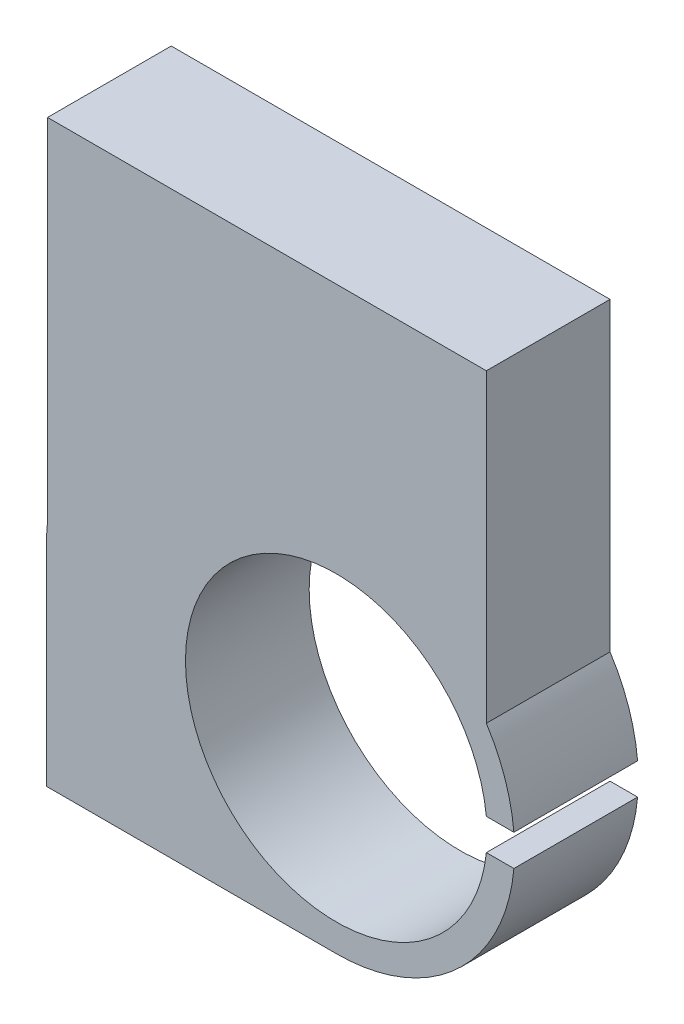
ISO-10303-21;
HEADER;
FILE_DESCRIPTION(('STEP AP214'),'2;1');
FILE_NAME('part.step','',(''),(''),'','','');
FILE_SCHEMA(('AUTOMOTIVE_DESIGN { 1 0 10303 214 1 1 1 1 }'));
ENDSEC;
DATA;
#1=APPLICATION_CONTEXT('core data for automotive mechanical design processes');
#2=APPLICATION_PROTOCOL_DEFINITION('international standard','automotive_design',2000,#1);
#3=PRODUCT_CONTEXT('',#1,'mechanical');
#4=PRODUCT('Part','Part','',(#3));
#5=PRODUCT_RELATED_PRODUCT_CATEGORY('part','',(#4));
#6=PRODUCT_DEFINITION_FORMATION('','',#4);
#7=PRODUCT_DEFINITION_CONTEXT('part definition',#1,'design');
#8=PRODUCT_DEFINITION('design','',#6,#7);
#9=PRODUCT_DEFINITION_SHAPE('','',#8);
#10=(LENGTH_UNIT() NAMED_UNIT(*) SI_UNIT(.MILLI.,.METRE.));
#11=(NAMED_UNIT(*) PLANE_ANGLE_UNIT() SI_UNIT($,.RADIAN.));
#12=(NAMED_UNIT(*) SI_UNIT($,.STERADIAN.) SOLID_ANGLE_UNIT());
#13=UNCERTAINTY_MEASURE_WITH_UNIT(LENGTH_MEASURE(1.E-05),#10,'distance_accuracy_value','');
#14=(GEOMETRIC_REPRESENTATION_CONTEXT(3) GLOBAL_UNCERTAINTY_ASSIGNED_CONTEXT((#13)) GLOBAL_UNIT_ASSIGNED_CONTEXT((#10,
#11,#12)) REPRESENTATION_CONTEXT('',''));
#15=CARTESIAN_POINT('',(0.,0.,0.));
#16=DIRECTION('',(0.,0.,1.));
#17=DIRECTION('',(1.,0.,0.));
#18=AXIS2_PLACEMENT_3D('',#15,#16,#17);
#19=CARTESIAN_POINT('',(-29.0092477147416,-3.56026036950048,28.));
#20=DIRECTION('',(0.,1.,0.));
#21=DIRECTION('',(0.,0.,1.));
#22=AXIS2_PLACEMENT_3D('',#19,#20,#21);
#23=PLANE('',#22);
#24=DIRECTION('',(0.,0.,-1.));
#25=VECTOR('',#24,1.);
#26=CARTESIAN_POINT('',(114.990752285258,-3.56026036950048,28.));
#27=LINE('',#26,#25);
#28=CARTESIAN_POINT('',(114.990752285258,-3.56026036950048,7.89310098485885));
#29=VERTEX_POINT('',#28);
#30=CARTESIAN_POINT('',(114.990752285258,-3.56026036950048,0.));
#31=VERTEX_POINT('',#30);
#32=EDGE_CURVE('E126',#29,#31,#27,.T.);
#33=ORIENTED_EDGE('',*,*,#32,.F.);
#34=DIRECTION('',(-1.,0.,0.));
#35=VECTOR('',#34,1.);
#36=CARTESIAN_POINT('',(-29.0092477147416,-3.56026036950048,7.89310098485885));
#37=LINE('',#36,#35);
#38=CARTESIAN_POINT('',(96.4918651622711,-3.56026036950047,7.89310098485885));
#39=VERTEX_POINT('',#38);
#40=EDGE_CURVE('E116',#29,#39,#37,.T.);
#41=ORIENTED_EDGE('',*,*,#40,.T.);
#42=DIRECTION('',(0.,0.,-1.));
#43=VECTOR('',#42,1.);
#44=CARTESIAN_POINT('',(96.4918651622711,-3.56026036950048,28.));
#45=LINE('',#44,#43);
#46=CARTESIAN_POINT('',(96.4918651622711,-3.56026036950048,0.));
#47=VERTEX_POINT('',#46);
#48=EDGE_CURVE('E124',#39,#47,#45,.T.);
#49=ORIENTED_EDGE('',*,*,#48,.T.);
#50=DIRECTION('',(1.,0.,0.));
#51=VECTOR('',#50,1.);
#52=CARTESIAN_POINT('',(-29.0092477147416,-3.56026036950048,0.));
#53=LINE('',#52,#51);
#54=EDGE_CURVE('E132',#47,#31,#53,.T.);
#55=ORIENTED_EDGE('',*,*,#54,.T.);
#56=EDGE_LOOP('',(#33,#41,#49,#55));
#57=FACE_BOUND('',#56,.T.);
#58=ADVANCED_FACE('F33',(#57),#23,.F.);
#59=CARTESIAN_POINT('',(114.990752285258,7.81473963049952,28.));
#60=DIRECTION('',(0.,0.,-1.));
#61=DIRECTION('',(-1.,0.,0.));
#62=AXIS2_PLACEMENT_3D('',#59,#60,#61);
#63=CYLINDRICAL_SURFACE('',#62,11.375);
#64=DIRECTION('',(0.,0.,-1.));
#65=VECTOR('',#64,1.);
#66=CARTESIAN_POINT('',(126.321710982562,6.81473963049952,28.));
#67=LINE('',#66,#65);
#68=CARTESIAN_POINT('',(126.321710982562,6.81473963049952,7.89310098485885));
#69=VERTEX_POINT('',#68);
#70=CARTESIAN_POINT('',(126.321710982562,6.81473963049952,0.));
#71=VERTEX_POINT('',#70);
#72=EDGE_CURVE('E172',#69,#71,#67,.T.);
#73=ORIENTED_EDGE('',*,*,#72,.F.);
#74=CARTESIAN_POINT('',(114.990752285258,7.81473963049952,7.89310098485885));
#75=DIRECTION('',(0.,0.,-1.));
#76=DIRECTION('',(0.,1.,0.));
#77=AXIS2_PLACEMENT_3D('',#74,#75,#76);
#78=CIRCLE('',#77,11.375);
#79=EDGE_CURVE('E128',#69,#29,#78,.T.);
#80=ORIENTED_EDGE('',*,*,#79,.T.);
#81=ORIENTED_EDGE('',*,*,#32,.T.);
#82=CARTESIAN_POINT('',(114.990752285258,7.81473963049952,0.));
#83=DIRECTION('',(0.,0.,1.));
#84=DIRECTION('',(1.,0.,0.));
#85=AXIS2_PLACEMENT_3D('',#82,#83,#84);
#86=CIRCLE('',#85,11.375);
#87=EDGE_CURVE('E134',#31,#71,#86,.T.);
#88=ORIENTED_EDGE('',*,*,#87,.T.);
#89=EDGE_LOOP('',(#73,#80,#81,#88));
#90=FACE_BOUND('',#89,.T.);
#91=ADVANCED_FACE('F186',(#90),#63,.T.);
#92=CARTESIAN_POINT('',(126.321710982562,6.81473963049952,28.));
#93=DIRECTION('',(0.,-1.,0.));
#94=DIRECTION('',(0.,0.,-1.));
#95=AXIS2_PLACEMENT_3D('',#92,#93,#94);
#96=PLANE('',#95);
#97=DIRECTION('',(0.,0.,-1.));
#98=VECTOR('',#97,1.);
#99=CARTESIAN_POINT('',(124.563663284531,6.81473963049952,28.));
#100=LINE('',#99,#98);
#101=CARTESIAN_POINT('',(124.563663284531,6.81473963049952,7.89310098485885));
#102=VERTEX_POINT('',#101);
#103=CARTESIAN_POINT('',(124.563663284531,6.81473963049952,0.));
#104=VERTEX_POINT('',#103);
#105=EDGE_CURVE('E170',#102,#104,#100,.T.);
#106=ORIENTED_EDGE('',*,*,#105,.F.);
#107=DIRECTION('',(1.,0.,0.));
#108=VECTOR('',#107,1.);
#109=CARTESIAN_POINT('',(126.321710982562,6.81473963049952,7.89310098485885));
#110=LINE('',#109,#108);
#111=EDGE_CURVE('E188',#102,#69,#110,.T.);
#112=ORIENTED_EDGE('',*,*,#111,.T.);
#113=ORIENTED_EDGE('',*,*,#72,.T.);
#114=DIRECTION('',(-1.,0.,0.));
#115=VECTOR('',#114,1.);
#116=CARTESIAN_POINT('',(126.321710982562,6.81473963049952,0.));
#117=LINE('',#116,#115);
#118=EDGE_CURVE('E140',#71,#104,#117,.T.);
#119=ORIENTED_EDGE('',*,*,#118,.T.);
#120=EDGE_LOOP('',(#106,#112,#113,#119));
#121=FACE_BOUND('',#120,.T.);
#122=ADVANCED_FACE('F233',(#121),#96,.F.);
#123=CARTESIAN_POINT('',(114.990752285258,7.81473963049952,28.));
#124=DIRECTION('',(0.,0.,-1.));
#125=DIRECTION('',(-1.,0.,0.));
#126=AXIS2_PLACEMENT_3D('',#123,#124,#125);
#127=CYLINDRICAL_SURFACE('',#126,9.62499999999999);
#128=DIRECTION('',(0.,0.,-1.));
#129=VECTOR('',#128,1.);
#130=CARTESIAN_POINT('',(124.563663284531,8.81473963049952,28.));
#131=LINE('',#130,#129);
#132=CARTESIAN_POINT('',(124.563663284531,8.81473963049952,7.89310098485885));
#133=VERTEX_POINT('',#132);
#134=CARTESIAN_POINT('',(124.563663284531,8.81473963049952,0.));
#135=VERTEX_POINT('',#134);
#136=EDGE_CURVE('E168',#133,#135,#131,.T.);
#137=ORIENTED_EDGE('',*,*,#136,.F.);
#138=CARTESIAN_POINT('',(114.990752285258,7.81473963049952,7.89310098485885));
#139=DIRECTION('',(0.,0.,-1.));
#140=DIRECTION('',(0.,1.,0.));
#141=AXIS2_PLACEMENT_3D('',#138,#139,#140);
#142=CIRCLE('',#141,9.62499999999999);
#143=EDGE_CURVE('E190',#133,#102,#142,.F.);
#144=ORIENTED_EDGE('',*,*,#143,.T.);
#145=ORIENTED_EDGE('',*,*,#105,.T.);
#146=CARTESIAN_POINT('',(114.990752285258,7.81473963049952,0.));
#147=DIRECTION('',(0.,0.,-1.));
#148=DIRECTION('',(1.,0.,0.));
#149=AXIS2_PLACEMENT_3D('',#146,#147,#148);
#150=CIRCLE('',#149,9.62499999999999);
#151=EDGE_CURVE('E143',#104,#135,#150,.T.);
#152=ORIENTED_EDGE('',*,*,#151,.T.);
#153=EDGE_LOOP('',(#137,#144,#145,#152));
#154=FACE_BOUND('',#153,.T.);
#155=ADVANCED_FACE('F230',(#154),#127,.F.);
#156=CARTESIAN_POINT('',(126.321710982562,8.81473963049952,28.));
#157=DIRECTION('',(0.,1.,0.));
#158=DIRECTION('',(0.,0.,1.));
#159=AXIS2_PLACEMENT_3D('',#156,#157,#158);
#160=PLANE('',#159);
#161=DIRECTION('',(0.,0.,-1.));
#162=VECTOR('',#161,1.);
#163=CARTESIAN_POINT('',(126.321710982562,8.81473963049952,28.));
#164=LINE('',#163,#162);
#165=CARTESIAN_POINT('',(126.321710982562,8.81473963049952,7.89310098485885));
#166=VERTEX_POINT('',#165);
#167=CARTESIAN_POINT('',(126.321710982562,8.81473963049952,0.));
#168=VERTEX_POINT('',#167);
#169=EDGE_CURVE('E166',#166,#168,#164,.T.);
#170=ORIENTED_EDGE('',*,*,#169,.F.);
#171=DIRECTION('',(-1.,0.,0.));
#172=VECTOR('',#171,1.);
#173=CARTESIAN_POINT('',(126.321710982562,8.81473963049952,7.89310098485885));
#174=LINE('',#173,#172);
#175=EDGE_CURVE('E195',#166,#133,#174,.T.);
#176=ORIENTED_EDGE('',*,*,#175,.T.);
#177=ORIENTED_EDGE('',*,*,#136,.T.);
#178=DIRECTION('',(1.,0.,0.));
#179=VECTOR('',#178,1.);
#180=CARTESIAN_POINT('',(126.321710982562,8.81473963049952,0.));
#181=LINE('',#180,#179);
#182=EDGE_CURVE('E146',#135,#168,#181,.T.);
#183=ORIENTED_EDGE('',*,*,#182,.T.);
#184=EDGE_LOOP('',(#170,#176,#177,#183));
#185=FACE_BOUND('',#184,.T.);
#186=ADVANCED_FACE('F227',(#185),#160,.F.);
#187=CARTESIAN_POINT('',(114.990752285258,7.81473963049952,28.));
#188=DIRECTION('',(0.,0.,-1.));
#189=DIRECTION('',(-1.,0.,0.));
#190=AXIS2_PLACEMENT_3D('',#187,#188,#189);
#191=CYLINDRICAL_SURFACE('',#190,11.375);
#192=DIRECTION('',(0.,0.,-1.));
#193=VECTOR('',#192,1.);
#194=CARTESIAN_POINT('',(124.563663284531,13.9588424942218,28.));
#195=LINE('',#194,#193);
#196=CARTESIAN_POINT('',(124.563663284531,13.9588424942218,7.89310098485885));
#197=VERTEX_POINT('',#196);
#198=CARTESIAN_POINT('',(124.563663284531,13.9588424942218,0.));
#199=VERTEX_POINT('',#198);
#200=EDGE_CURVE('E164',#197,#199,#195,.T.);
#201=ORIENTED_EDGE('',*,*,#200,.F.);
#202=CARTESIAN_POINT('',(114.990752285258,7.81473963049952,7.89310098485885));
#203=DIRECTION('',(0.,0.,-1.));
#204=DIRECTION('',(0.,1.,0.));
#205=AXIS2_PLACEMENT_3D('',#202,#203,#204);
#206=CIRCLE('',#205,11.375);
#207=EDGE_CURVE('E198',#197,#166,#206,.T.);
#208=ORIENTED_EDGE('',*,*,#207,.T.);
#209=ORIENTED_EDGE('',*,*,#169,.T.);
#210=CARTESIAN_POINT('',(114.990752285258,7.81473963049952,0.));
#211=DIRECTION('',(0.,0.,1.));
#212=DIRECTION('',(1.,0.,0.));
#213=AXIS2_PLACEMENT_3D('',#210,#211,#212);
#214=CIRCLE('',#213,11.375);
#215=EDGE_CURVE('E149',#168,#199,#214,.T.);
#216=ORIENTED_EDGE('',*,*,#215,.T.);
#217=EDGE_LOOP('',(#201,#208,#209,#216));
#218=FACE_BOUND('',#217,.T.);
#219=ADVANCED_FACE('F224',(#218),#191,.T.);
#220=CARTESIAN_POINT('',(124.563663284531,13.9588424942218,28.));
#221=DIRECTION('',(-1.,0.,0.));
#222=DIRECTION('',(0.,0.,1.));
#223=AXIS2_PLACEMENT_3D('',#220,#221,#222);
#224=PLANE('',#223);
#225=DIRECTION('',(0.,0.,-1.));
#226=VECTOR('',#225,1.);
#227=CARTESIAN_POINT('',(124.563663284531,33.4397396304995,28.));
#228=LINE('',#227,#226);
#229=CARTESIAN_POINT('',(124.563663284531,33.4397396304995,7.89310098485885));
#230=VERTEX_POINT('',#229);
#231=CARTESIAN_POINT('',(124.563663284531,33.4397396304995,0.));
#232=VERTEX_POINT('',#231);
#233=EDGE_CURVE('E162',#230,#232,#228,.T.);
#234=ORIENTED_EDGE('',*,*,#233,.F.);
#235=DIRECTION('',(0.,-1.,0.));
#236=VECTOR('',#235,1.);
#237=CARTESIAN_POINT('',(124.563663284531,13.9588424942218,7.89310098485885));
#238=LINE('',#237,#236);
#239=EDGE_CURVE('E201',#230,#197,#238,.T.);
#240=ORIENTED_EDGE('',*,*,#239,.T.);
#241=ORIENTED_EDGE('',*,*,#200,.T.);
#242=DIRECTION('',(0.,1.,0.));
#243=VECTOR('',#242,1.);
#244=CARTESIAN_POINT('',(124.563663284531,13.9588424942218,0.));
#245=LINE('',#244,#243);
#246=EDGE_CURVE('E152',#199,#232,#245,.T.);
#247=ORIENTED_EDGE('',*,*,#246,.T.);
#248=EDGE_LOOP('',(#234,#240,#241,#247));
#249=FACE_BOUND('',#248,.T.);
#250=ADVANCED_FACE('F221',(#249),#224,.F.);
#251=CARTESIAN_POINT('',(124.563663284531,33.4397396304995,28.));
#252=DIRECTION('',(0.,-1.,0.));
#253=DIRECTION('',(0.,0.,-1.));
#254=AXIS2_PLACEMENT_3D('',#251,#252,#253);
#255=PLANE('',#254);
#256=DIRECTION('',(0.,0.,-1.));
#257=VECTOR('',#256,1.);
#258=CARTESIAN_POINT('',(96.5636632845313,33.4397396304995,28.));
#259=LINE('',#258,#257);
#260=CARTESIAN_POINT('',(96.5636632845313,33.4397396304995,7.89310098485885));
#261=VERTEX_POINT('',#260);
#262=CARTESIAN_POINT('',(96.5636632845313,33.4397396304995,0.));
#263=VERTEX_POINT('',#262);
#264=EDGE_CURVE('E160',#261,#263,#259,.T.);
#265=ORIENTED_EDGE('',*,*,#264,.F.);
#266=DIRECTION('',(1.,0.,0.));
#267=VECTOR('',#266,1.);
#268=CARTESIAN_POINT('',(124.563663284531,33.4397396304995,7.89310098485885));
#269=LINE('',#268,#267);
#270=EDGE_CURVE('E204',#261,#230,#269,.T.);
#271=ORIENTED_EDGE('',*,*,#270,.T.);
#272=ORIENTED_EDGE('',*,*,#233,.T.);
#273=DIRECTION('',(-1.,0.,0.));
#274=VECTOR('',#273,1.);
#275=CARTESIAN_POINT('',(124.563663284531,33.4397396304995,0.));
#276=LINE('',#275,#274);
#277=EDGE_CURVE('E155',#232,#263,#276,.T.);
#278=ORIENTED_EDGE('',*,*,#277,.T.);
#279=EDGE_LOOP('',(#265,#271,#272,#278));
#280=FACE_BOUND('',#279,.T.);
#281=ADVANCED_FACE('F214',(#280),#255,.F.);
#282=CARTESIAN_POINT('',(96.5636632845313,33.4397396304995,28.));
#283=DIRECTION('',(1.,0.,0.));
#284=DIRECTION('',(0.,1.,0.));
#285=AXIS2_PLACEMENT_3D('',#282,#283,#284);
#286=PLANE('',#285);
#287=DIRECTION('',(0.,0.,-1.));
#288=VECTOR('',#287,1.);
#289=CARTESIAN_POINT('',(96.5636632845312,11.4397396304995,28.));
#290=LINE('',#289,#288);
#291=CARTESIAN_POINT('',(96.5636632845312,11.4397396304995,0.));
#292=VERTEX_POINT('',#291);
#293=CARTESIAN_POINT('',(96.5636632845312,11.4397396304995,7.89310098485885));
#294=VERTEX_POINT('',#293);
#295=EDGE_CURVE('E175',#292,#294,#290,.F.);
#296=ORIENTED_EDGE('',*,*,#295,.T.);
#297=DIRECTION('',(0.,1.,0.));
#298=VECTOR('',#297,1.);
#299=CARTESIAN_POINT('',(96.5636632845313,33.4397396304995,7.89310098485885));
#300=LINE('',#299,#298);
#301=EDGE_CURVE('E207',#294,#261,#300,.T.);
#302=ORIENTED_EDGE('',*,*,#301,.T.);
#303=ORIENTED_EDGE('',*,*,#264,.T.);
#304=DIRECTION('',(0.,-1.,0.));
#305=VECTOR('',#304,1.);
#306=CARTESIAN_POINT('',(96.5636632845313,33.4397396304995,0.));
#307=LINE('',#306,#305);
#308=EDGE_CURVE('E158',#263,#292,#307,.T.);
#309=ORIENTED_EDGE('',*,*,#308,.T.);
#310=EDGE_LOOP('',(#296,#302,#303,#309));
#311=FACE_BOUND('',#310,.T.);
#312=ADVANCED_FACE('F212',(#311),#286,.F.);
#313=CARTESIAN_POINT('',(-29.0092477147416,7.81473963049952,0.));
#314=DIRECTION('',(0.,0.,1.));
#315=DIRECTION('',(1.,0.,0.));
#316=AXIS2_PLACEMENT_3D('',#313,#314,#315);
#317=PLANE('',#316);
#318=ORIENTED_EDGE('',*,*,#54,.F.);
#319=DIRECTION('',(0.,1.,0.));
#320=VECTOR('',#319,1.);
#321=CARTESIAN_POINT('',(96.4918651622711,7.81473963049952,0.));
#322=LINE('',#321,#320);
#323=CARTESIAN_POINT('',(96.4918651622711,10.2435759816442,0.));
#324=VERTEX_POINT('',#323);
#325=EDGE_CURVE('E127',#47,#324,#322,.T.);
#326=ORIENTED_EDGE('',*,*,#325,.T.);
#327=CARTESIAN_POINT('',(86.5636632845312,11.4397396304995,0.));
#328=DIRECTION('',(0.,0.,1.));
#329=DIRECTION('',(1.,0.,0.));
#330=AXIS2_PLACEMENT_3D('',#327,#328,#329);
#331=CIRCLE('',#330,10.);
#332=EDGE_CURVE('E55',#324,#292,#331,.T.);
#333=ORIENTED_EDGE('',*,*,#332,.T.);
#334=ORIENTED_EDGE('',*,*,#308,.F.);
#335=ORIENTED_EDGE('',*,*,#277,.F.);
#336=ORIENTED_EDGE('',*,*,#246,.F.);
#337=ORIENTED_EDGE('',*,*,#215,.F.);
#338=ORIENTED_EDGE('',*,*,#182,.F.);
#339=ORIENTED_EDGE('',*,*,#151,.F.);
#340=ORIENTED_EDGE('',*,*,#118,.F.);
#341=ORIENTED_EDGE('',*,*,#87,.F.);
#342=EDGE_LOOP('',(#318,#326,#333,#334,#335,#336,#337,#338,#339,#340,#341));
#343=FACE_BOUND('',#342,.T.);
#344=ADVANCED_FACE('F180',(#343),#317,.F.);
#345=CARTESIAN_POINT('',(86.5636632845312,11.4397396304995,28.));
#346=DIRECTION('',(0.,0.,1.));
#347=DIRECTION('',(1.,0.,0.));
#348=AXIS2_PLACEMENT_3D('',#345,#346,#347);
#349=CYLINDRICAL_SURFACE('',#348,10.);
#350=DIRECTION('',(0.,0.,1.));
#351=VECTOR('',#350,1.);
#352=CARTESIAN_POINT('',(96.4918651622711,10.2435759816442,28.));
#353=LINE('',#352,#351);
#354=CARTESIAN_POINT('',(96.4918651622711,10.2435759816442,7.89310098485885));
#355=VERTEX_POINT('',#354);
#356=EDGE_CURVE('E41',#324,#355,#353,.T.);
#357=ORIENTED_EDGE('',*,*,#356,.T.);
#358=CARTESIAN_POINT('',(86.5636632845312,11.4397396304995,7.89310098485885));
#359=DIRECTION('',(0.,0.,-1.));
#360=DIRECTION('',(0.,1.,0.));
#361=AXIS2_PLACEMENT_3D('',#358,#359,#360);
#362=CIRCLE('',#361,10.);
#363=EDGE_CURVE('E48',#355,#294,#362,.F.);
#364=ORIENTED_EDGE('',*,*,#363,.T.);
#365=ORIENTED_EDGE('',*,*,#295,.F.);
#366=ORIENTED_EDGE('',*,*,#332,.F.);
#367=EDGE_LOOP('',(#357,#364,#365,#366));
#368=FACE_BOUND('',#367,.T.);
#369=ADVANCED_FACE('F35',(#368),#349,.F.);
#370=CARTESIAN_POINT('',(96.4918651622711,62.4990347196175,-28.));
#371=DIRECTION('',(1.,0.,0.));
#372=DIRECTION('',(0.,0.,-1.));
#373=AXIS2_PLACEMENT_3D('',#370,#371,#372);
#374=PLANE('',#373);
#375=ORIENTED_EDGE('',*,*,#48,.F.);
#376=DIRECTION('',(0.,1.,0.));
#377=VECTOR('',#376,1.);
#378=CARTESIAN_POINT('',(96.4918651622711,62.4990347196175,7.89310098485884));
#379=LINE('',#378,#377);
#380=EDGE_CURVE('E11',#39,#355,#379,.T.);
#381=ORIENTED_EDGE('',*,*,#380,.T.);
#382=ORIENTED_EDGE('',*,*,#356,.F.);
#383=ORIENTED_EDGE('',*,*,#325,.F.);
#384=EDGE_LOOP('',(#375,#381,#382,#383));
#385=FACE_BOUND('',#384,.T.);
#386=ADVANCED_FACE('F130',(#385),#374,.F.);
#387=CARTESIAN_POINT('',(135.491865162271,34.5927316387367,7.89310098485885));
#388=DIRECTION('',(0.,0.,-1.));
#389=DIRECTION('',(0.,1.,0.));
#390=AXIS2_PLACEMENT_3D('',#387,#388,#389);
#391=PLANE('',#390);
#392=ORIENTED_EDGE('',*,*,#79,.F.);
#393=ORIENTED_EDGE('',*,*,#111,.F.);
#394=ORIENTED_EDGE('',*,*,#143,.F.);
#395=ORIENTED_EDGE('',*,*,#175,.F.);
#396=ORIENTED_EDGE('',*,*,#207,.F.);
#397=ORIENTED_EDGE('',*,*,#239,.F.);
#398=ORIENTED_EDGE('',*,*,#270,.F.);
#399=ORIENTED_EDGE('',*,*,#301,.F.);
#400=ORIENTED_EDGE('',*,*,#363,.F.);
#401=ORIENTED_EDGE('',*,*,#380,.F.);
#402=ORIENTED_EDGE('',*,*,#40,.F.);
#403=EDGE_LOOP('',(#392,#393,#394,#395,#396,#397,#398,#399,#400,#401,#402));
#404=FACE_BOUND('',#403,.T.);
#405=ADVANCED_FACE('F115',(#404),#391,.F.);
#406=CLOSED_SHELL('',(#58,#91,#122,#155,#186,#219,#250,#281,#312,#344,#369,#386,#405));
#407=MANIFOLD_SOLID_BREP('B2',#406);
#408=ADVANCED_BREP_SHAPE_REPRESENTATION('',(#18,#407),#14);
#409=SHAPE_DEFINITION_REPRESENTATION(#9,#408);
ENDSEC;
END-ISO-10303-21;
